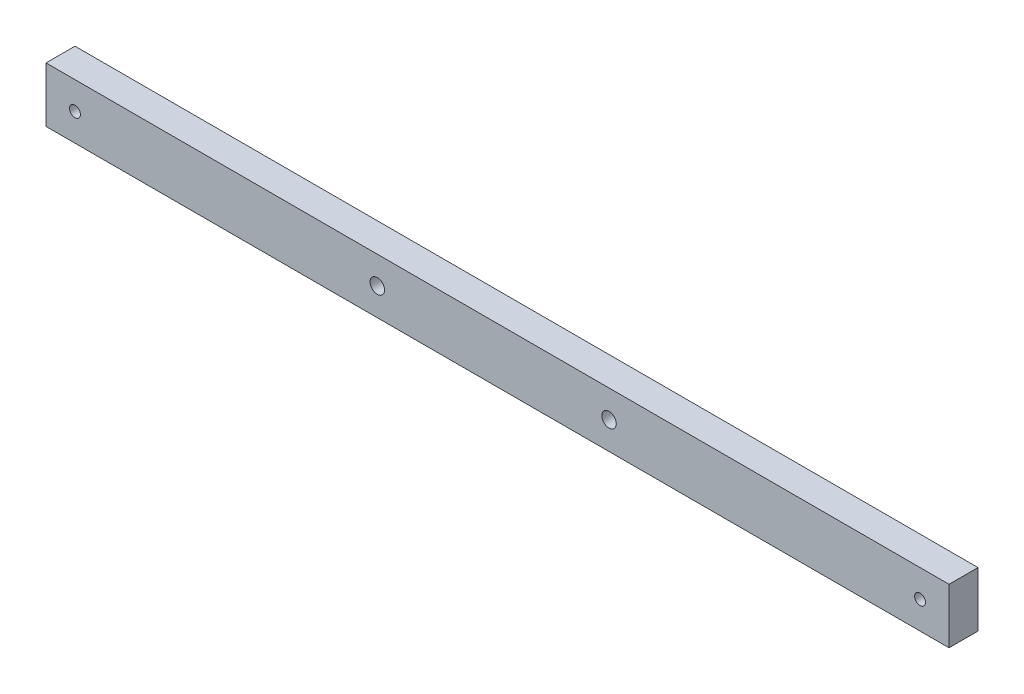
ISO-10303-21;
HEADER;
FILE_DESCRIPTION(('STEP AP214'),'2;1');
FILE_NAME('part.step','',(''),(''),'','','');
FILE_SCHEMA(('AUTOMOTIVE_DESIGN { 1 0 10303 214 1 1 1 1 }'));
ENDSEC;
DATA;
#1=APPLICATION_CONTEXT('core data for automotive mechanical design processes');
#2=APPLICATION_PROTOCOL_DEFINITION('international standard','automotive_design',2000,#1);
#3=PRODUCT_CONTEXT('',#1,'mechanical');
#4=PRODUCT('Part','Part','',(#3));
#5=PRODUCT_RELATED_PRODUCT_CATEGORY('part','',(#4));
#6=PRODUCT_DEFINITION_FORMATION('','',#4);
#7=PRODUCT_DEFINITION_CONTEXT('part definition',#1,'design');
#8=PRODUCT_DEFINITION('design','',#6,#7);
#9=PRODUCT_DEFINITION_SHAPE('','',#8);
#10=(LENGTH_UNIT() NAMED_UNIT(*) SI_UNIT(.MILLI.,.METRE.));
#11=(NAMED_UNIT(*) PLANE_ANGLE_UNIT() SI_UNIT($,.RADIAN.));
#12=(NAMED_UNIT(*) SI_UNIT($,.STERADIAN.) SOLID_ANGLE_UNIT());
#13=UNCERTAINTY_MEASURE_WITH_UNIT(LENGTH_MEASURE(1.E-05),#10,'distance_accuracy_value','');
#14=(GEOMETRIC_REPRESENTATION_CONTEXT(3) GLOBAL_UNCERTAINTY_ASSIGNED_CONTEXT((#13)) GLOBAL_UNIT_ASSIGNED_CONTEXT((#10,
#11,#12)) REPRESENTATION_CONTEXT('',''));
#15=CARTESIAN_POINT('',(0.,0.,0.));
#16=DIRECTION('',(0.,0.,1.));
#17=DIRECTION('',(1.,0.,0.));
#18=AXIS2_PLACEMENT_3D('',#15,#16,#17);
#19=CARTESIAN_POINT('',(0.,0.,2.));
#20=DIRECTION('',(0.,0.,1.));
#21=DIRECTION('',(1.,0.,0.));
#22=AXIS2_PLACEMENT_3D('',#19,#20,#21);
#23=PLANE('',#22);
#24=CARTESIAN_POINT('',(-29.175,0.,2.));
#25=DIRECTION('',(0.,0.,1.));
#26=DIRECTION('',(1.,0.,0.));
#27=AXIS2_PLACEMENT_3D('',#24,#25,#26);
#28=CIRCLE('',#27,0.374999999999999);
#29=CARTESIAN_POINT('',(-28.8,0.,2.));
#30=VERTEX_POINT('',#29);
#31=EDGE_CURVE('E154',#30,#30,#28,.F.);
#32=ORIENTED_EDGE('',*,*,#31,.T.);
#33=EDGE_LOOP('',(#32));
#34=FACE_BOUND('',#33,.T.);
#35=CARTESIAN_POINT('',(29.175,0.,2.));
#36=DIRECTION('',(0.,0.,1.));
#37=DIRECTION('',(1.,0.,0.));
#38=AXIS2_PLACEMENT_3D('',#35,#36,#37);
#39=CIRCLE('',#38,0.374999999999999);
#40=CARTESIAN_POINT('',(29.55,0.,2.));
#41=VERTEX_POINT('',#40);
#42=EDGE_CURVE('E146',#41,#41,#39,.F.);
#43=ORIENTED_EDGE('',*,*,#42,.T.);
#44=EDGE_LOOP('',(#43));
#45=FACE_BOUND('',#44,.T.);
#46=CARTESIAN_POINT('',(7.7,0.,2.));
#47=DIRECTION('',(0.,0.,1.));
#48=DIRECTION('',(1.,0.,0.));
#49=AXIS2_PLACEMENT_3D('',#46,#47,#48);
#50=CIRCLE('',#49,0.500000000000001);
#51=CARTESIAN_POINT('',(8.2,0.,2.));
#52=VERTEX_POINT('',#51);
#53=EDGE_CURVE('E112',#52,#52,#50,.T.);
#54=ORIENTED_EDGE('',*,*,#53,.F.);
#55=EDGE_LOOP('',(#54));
#56=FACE_BOUND('',#55,.T.);
#57=DIRECTION('',(0.,1.,0.));
#58=VECTOR('',#57,1.);
#59=CARTESIAN_POINT('',(31.175,1.9,2.));
#60=LINE('',#59,#58);
#61=CARTESIAN_POINT('',(31.175,-1.9,2.));
#62=VERTEX_POINT('',#61);
#63=CARTESIAN_POINT('',(31.175,1.9,2.));
#64=VERTEX_POINT('',#63);
#65=EDGE_CURVE('E92',#62,#64,#60,.T.);
#66=ORIENTED_EDGE('',*,*,#65,.T.);
#67=DIRECTION('',(-1.,0.,0.));
#68=VECTOR('',#67,1.);
#69=CARTESIAN_POINT('',(-31.175,1.9,2.));
#70=LINE('',#69,#68);
#71=CARTESIAN_POINT('',(-31.175,1.9,2.));
#72=VERTEX_POINT('',#71);
#73=EDGE_CURVE('E87',#64,#72,#70,.T.);
#74=ORIENTED_EDGE('',*,*,#73,.T.);
#75=DIRECTION('',(0.,-1.,0.));
#76=VECTOR('',#75,1.);
#77=CARTESIAN_POINT('',(-31.175,1.9,2.));
#78=LINE('',#77,#76);
#79=CARTESIAN_POINT('',(-31.175,-1.9,2.));
#80=VERTEX_POINT('',#79);
#81=EDGE_CURVE('E90',#72,#80,#78,.T.);
#82=ORIENTED_EDGE('',*,*,#81,.T.);
#83=DIRECTION('',(1.,0.,0.));
#84=VECTOR('',#83,1.);
#85=CARTESIAN_POINT('',(-31.175,-1.9,2.));
#86=LINE('',#85,#84);
#87=EDGE_CURVE('E57',#80,#62,#86,.T.);
#88=ORIENTED_EDGE('',*,*,#87,.T.);
#89=EDGE_LOOP('',(#66,#74,#82,#88));
#90=FACE_BOUND('',#89,.T.);
#91=CARTESIAN_POINT('',(-8.3,0.,2.));
#92=DIRECTION('',(0.,0.,1.));
#93=DIRECTION('',(1.,0.,0.));
#94=AXIS2_PLACEMENT_3D('',#91,#92,#93);
#95=CIRCLE('',#94,0.500000000000001);
#96=CARTESIAN_POINT('',(-7.8,0.,2.));
#97=VERTEX_POINT('',#96);
#98=EDGE_CURVE('E134',#97,#97,#95,.T.);
#99=ORIENTED_EDGE('',*,*,#98,.F.);
#100=EDGE_LOOP('',(#99));
#101=FACE_BOUND('',#100,.T.);
#102=ADVANCED_FACE('F39',(#34,#45,#56,#90,#101),#23,.T.);
#103=CARTESIAN_POINT('',(0.,0.,0.));
#104=DIRECTION('',(0.,0.,1.));
#105=DIRECTION('',(1.,0.,0.));
#106=AXIS2_PLACEMENT_3D('',#103,#104,#105);
#107=PLANE('',#106);
#108=CARTESIAN_POINT('',(-29.175,0.,0.));
#109=DIRECTION('',(0.,0.,-1.));
#110=DIRECTION('',(-1.,0.,0.));
#111=AXIS2_PLACEMENT_3D('',#108,#109,#110);
#112=CIRCLE('',#111,0.374999999999999);
#113=CARTESIAN_POINT('',(-29.55,0.,0.));
#114=VERTEX_POINT('',#113);
#115=EDGE_CURVE('E142',#114,#114,#112,.T.);
#116=ORIENTED_EDGE('',*,*,#115,.F.);
#117=EDGE_LOOP('',(#116));
#118=FACE_BOUND('',#117,.T.);
#119=CARTESIAN_POINT('',(29.175,0.,0.));
#120=DIRECTION('',(0.,0.,-1.));
#121=DIRECTION('',(-1.,0.,0.));
#122=AXIS2_PLACEMENT_3D('',#119,#120,#121);
#123=CIRCLE('',#122,0.374999999999999);
#124=CARTESIAN_POINT('',(28.8,0.,0.));
#125=VERTEX_POINT('',#124);
#126=EDGE_CURVE('E150',#125,#125,#123,.T.);
#127=ORIENTED_EDGE('',*,*,#126,.F.);
#128=EDGE_LOOP('',(#127));
#129=FACE_BOUND('',#128,.T.);
#130=DIRECTION('',(0.,1.,0.));
#131=VECTOR('',#130,1.);
#132=CARTESIAN_POINT('',(31.175,1.9,0.));
#133=LINE('',#132,#131);
#134=CARTESIAN_POINT('',(31.175,-1.9,0.));
#135=VERTEX_POINT('',#134);
#136=CARTESIAN_POINT('',(31.175,1.9,0.));
#137=VERTEX_POINT('',#136);
#138=EDGE_CURVE('E108',#135,#137,#133,.T.);
#139=ORIENTED_EDGE('',*,*,#138,.F.);
#140=DIRECTION('',(1.,0.,0.));
#141=VECTOR('',#140,1.);
#142=CARTESIAN_POINT('',(-31.175,-1.9,0.));
#143=LINE('',#142,#141);
#144=CARTESIAN_POINT('',(-31.175,-1.9,0.));
#145=VERTEX_POINT('',#144);
#146=EDGE_CURVE('E80',#145,#135,#143,.T.);
#147=ORIENTED_EDGE('',*,*,#146,.F.);
#148=DIRECTION('',(0.,-1.,0.));
#149=VECTOR('',#148,1.);
#150=CARTESIAN_POINT('',(-31.175,1.9,0.));
#151=LINE('',#150,#149);
#152=CARTESIAN_POINT('',(-31.175,1.9,0.));
#153=VERTEX_POINT('',#152);
#154=EDGE_CURVE('E74',#153,#145,#151,.T.);
#155=ORIENTED_EDGE('',*,*,#154,.F.);
#156=DIRECTION('',(-1.,0.,0.));
#157=VECTOR('',#156,1.);
#158=CARTESIAN_POINT('',(-31.175,1.9,0.));
#159=LINE('',#158,#157);
#160=EDGE_CURVE('E97',#137,#153,#159,.T.);
#161=ORIENTED_EDGE('',*,*,#160,.F.);
#162=EDGE_LOOP('',(#139,#147,#155,#161));
#163=FACE_BOUND('',#162,.T.);
#164=CARTESIAN_POINT('',(7.7,0.,0.));
#165=DIRECTION('',(0.,0.,1.));
#166=DIRECTION('',(1.,0.,0.));
#167=AXIS2_PLACEMENT_3D('',#164,#165,#166);
#168=CIRCLE('',#167,0.500000000000001);
#169=CARTESIAN_POINT('',(8.2,0.,0.));
#170=VERTEX_POINT('',#169);
#171=EDGE_CURVE('E130',#170,#170,#168,.T.);
#172=ORIENTED_EDGE('',*,*,#171,.T.);
#173=EDGE_LOOP('',(#172));
#174=FACE_BOUND('',#173,.T.);
#175=CARTESIAN_POINT('',(-8.3,0.,0.));
#176=DIRECTION('',(0.,0.,1.));
#177=DIRECTION('',(1.,0.,0.));
#178=AXIS2_PLACEMENT_3D('',#175,#176,#177);
#179=CIRCLE('',#178,0.500000000000001);
#180=CARTESIAN_POINT('',(-7.8,0.,0.));
#181=VERTEX_POINT('',#180);
#182=EDGE_CURVE('E138',#181,#181,#179,.T.);
#183=ORIENTED_EDGE('',*,*,#182,.T.);
#184=EDGE_LOOP('',(#183));
#185=FACE_BOUND('',#184,.T.);
#186=ADVANCED_FACE('F125',(#118,#129,#163,#174,#185),#107,.F.);
#187=CARTESIAN_POINT('',(31.175,1.9,2.));
#188=DIRECTION('',(-1.,0.,0.));
#189=DIRECTION('',(0.,0.,1.));
#190=AXIS2_PLACEMENT_3D('',#187,#188,#189);
#191=PLANE('',#190);
#192=ORIENTED_EDGE('',*,*,#138,.T.);
#193=DIRECTION('',(0.,0.,-1.));
#194=VECTOR('',#193,1.);
#195=CARTESIAN_POINT('',(31.175,1.9,2.));
#196=LINE('',#195,#194);
#197=EDGE_CURVE('E11',#64,#137,#196,.T.);
#198=ORIENTED_EDGE('',*,*,#197,.F.);
#199=ORIENTED_EDGE('',*,*,#65,.F.);
#200=DIRECTION('',(0.,0.,-1.));
#201=VECTOR('',#200,1.);
#202=CARTESIAN_POINT('',(31.175,-1.9,2.));
#203=LINE('',#202,#201);
#204=EDGE_CURVE('E104',#62,#135,#203,.T.);
#205=ORIENTED_EDGE('',*,*,#204,.T.);
#206=EDGE_LOOP('',(#192,#198,#199,#205));
#207=FACE_BOUND('',#206,.T.);
#208=ADVANCED_FACE('F41',(#207),#191,.F.);
#209=CARTESIAN_POINT('',(-31.175,1.9,2.));
#210=DIRECTION('',(0.,-1.,0.));
#211=DIRECTION('',(0.,0.,-1.));
#212=AXIS2_PLACEMENT_3D('',#209,#210,#211);
#213=PLANE('',#212);
#214=ORIENTED_EDGE('',*,*,#160,.T.);
#215=DIRECTION('',(0.,0.,-1.));
#216=VECTOR('',#215,1.);
#217=CARTESIAN_POINT('',(-31.175,1.9,2.));
#218=LINE('',#217,#216);
#219=EDGE_CURVE('E49',#72,#153,#218,.T.);
#220=ORIENTED_EDGE('',*,*,#219,.F.);
#221=ORIENTED_EDGE('',*,*,#73,.F.);
#222=ORIENTED_EDGE('',*,*,#197,.T.);
#223=EDGE_LOOP('',(#214,#220,#221,#222));
#224=FACE_BOUND('',#223,.T.);
#225=ADVANCED_FACE('F96',(#224),#213,.F.);
#226=CARTESIAN_POINT('',(-31.175,1.9,2.));
#227=DIRECTION('',(1.,0.,0.));
#228=DIRECTION('',(0.,0.,-1.));
#229=AXIS2_PLACEMENT_3D('',#226,#227,#228);
#230=PLANE('',#229);
#231=ORIENTED_EDGE('',*,*,#154,.T.);
#232=DIRECTION('',(0.,0.,-1.));
#233=VECTOR('',#232,1.);
#234=CARTESIAN_POINT('',(-31.175,-1.9,2.));
#235=LINE('',#234,#233);
#236=EDGE_CURVE('E99',#80,#145,#235,.T.);
#237=ORIENTED_EDGE('',*,*,#236,.F.);
#238=ORIENTED_EDGE('',*,*,#81,.F.);
#239=ORIENTED_EDGE('',*,*,#219,.T.);
#240=EDGE_LOOP('',(#231,#237,#238,#239));
#241=FACE_BOUND('',#240,.T.);
#242=ADVANCED_FACE('F100',(#241),#230,.F.);
#243=CARTESIAN_POINT('',(-31.175,-1.9,2.));
#244=DIRECTION('',(0.,1.,0.));
#245=DIRECTION('',(0.,0.,1.));
#246=AXIS2_PLACEMENT_3D('',#243,#244,#245);
#247=PLANE('',#246);
#248=ORIENTED_EDGE('',*,*,#146,.T.);
#249=ORIENTED_EDGE('',*,*,#204,.F.);
#250=ORIENTED_EDGE('',*,*,#87,.F.);
#251=ORIENTED_EDGE('',*,*,#236,.T.);
#252=EDGE_LOOP('',(#248,#249,#250,#251));
#253=FACE_BOUND('',#252,.T.);
#254=ADVANCED_FACE('F122',(#253),#247,.F.);
#255=CARTESIAN_POINT('',(7.7,0.,2.));
#256=DIRECTION('',(0.,0.,-1.));
#257=DIRECTION('',(-1.,0.,0.));
#258=AXIS2_PLACEMENT_3D('',#255,#256,#257);
#259=CYLINDRICAL_SURFACE('',#258,0.500000000000001);
#260=ORIENTED_EDGE('',*,*,#53,.T.);
#261=EDGE_LOOP('',(#260));
#262=FACE_BOUND('',#261,.T.);
#263=ORIENTED_EDGE('',*,*,#171,.F.);
#264=EDGE_LOOP('',(#263));
#265=FACE_BOUND('',#264,.T.);
#266=ADVANCED_FACE('F180',(#262,#265),#259,.F.);
#267=CARTESIAN_POINT('',(-8.3,0.,2.));
#268=DIRECTION('',(0.,0.,-1.));
#269=DIRECTION('',(-1.,0.,0.));
#270=AXIS2_PLACEMENT_3D('',#267,#268,#269);
#271=CYLINDRICAL_SURFACE('',#270,0.500000000000001);
#272=ORIENTED_EDGE('',*,*,#98,.T.);
#273=EDGE_LOOP('',(#272));
#274=FACE_BOUND('',#273,.T.);
#275=ORIENTED_EDGE('',*,*,#182,.F.);
#276=EDGE_LOOP('',(#275));
#277=FACE_BOUND('',#276,.T.);
#278=ADVANCED_FACE('F171',(#274,#277),#271,.F.);
#279=CARTESIAN_POINT('',(29.175,0.,2.001));
#280=DIRECTION('',(0.,0.,-1.));
#281=DIRECTION('',(-1.,0.,0.));
#282=AXIS2_PLACEMENT_3D('',#279,#280,#281);
#283=CYLINDRICAL_SURFACE('',#282,0.374999999999999);
#284=ORIENTED_EDGE('',*,*,#42,.F.);
#285=EDGE_LOOP('',(#284));
#286=FACE_BOUND('',#285,.T.);
#287=ORIENTED_EDGE('',*,*,#126,.T.);
#288=EDGE_LOOP('',(#287));
#289=FACE_BOUND('',#288,.T.);
#290=ADVANCED_FACE('F169',(#286,#289),#283,.F.);
#291=CARTESIAN_POINT('',(-29.175,0.,2.001));
#292=DIRECTION('',(0.,0.,-1.));
#293=DIRECTION('',(-1.,0.,0.));
#294=AXIS2_PLACEMENT_3D('',#291,#292,#293);
#295=CYLINDRICAL_SURFACE('',#294,0.374999999999999);
#296=ORIENTED_EDGE('',*,*,#31,.F.);
#297=EDGE_LOOP('',(#296));
#298=FACE_BOUND('',#297,.T.);
#299=ORIENTED_EDGE('',*,*,#115,.T.);
#300=EDGE_LOOP('',(#299));
#301=FACE_BOUND('',#300,.T.);
#302=ADVANCED_FACE('F162',(#298,#301),#295,.F.);
#303=CLOSED_SHELL('',(#102,#186,#208,#225,#242,#254,#266,#278,#290,#302));
#304=MANIFOLD_SOLID_BREP('B2',#303);
#305=ADVANCED_BREP_SHAPE_REPRESENTATION('',(#18,#304),#14);
#306=SHAPE_DEFINITION_REPRESENTATION(#9,#305);
ENDSEC;
END-ISO-10303-21;
